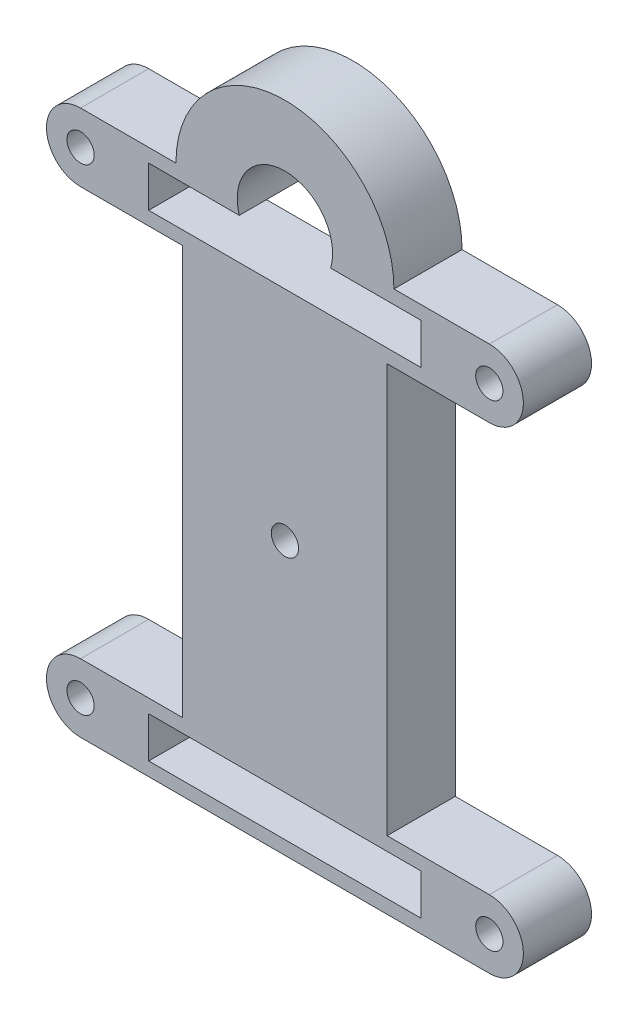
ISO-10303-21;
HEADER;
FILE_DESCRIPTION(('STEP AP214'),'2;1');
FILE_NAME('part.step','',(''),(''),'','','');
FILE_SCHEMA(('AUTOMOTIVE_DESIGN { 1 0 10303 214 1 1 1 1 }'));
ENDSEC;
DATA;
#1=APPLICATION_CONTEXT('core data for automotive mechanical design processes');
#2=APPLICATION_PROTOCOL_DEFINITION('international standard','automotive_design',2000,#1);
#3=PRODUCT_CONTEXT('',#1,'mechanical');
#4=PRODUCT('Part','Part','',(#3));
#5=PRODUCT_RELATED_PRODUCT_CATEGORY('part','',(#4));
#6=PRODUCT_DEFINITION_FORMATION('','',#4);
#7=PRODUCT_DEFINITION_CONTEXT('part definition',#1,'design');
#8=PRODUCT_DEFINITION('design','',#6,#7);
#9=PRODUCT_DEFINITION_SHAPE('','',#8);
#10=(LENGTH_UNIT() NAMED_UNIT(*) SI_UNIT(.MILLI.,.METRE.));
#11=(NAMED_UNIT(*) PLANE_ANGLE_UNIT() SI_UNIT($,.RADIAN.));
#12=(NAMED_UNIT(*) SI_UNIT($,.STERADIAN.) SOLID_ANGLE_UNIT());
#13=UNCERTAINTY_MEASURE_WITH_UNIT(LENGTH_MEASURE(1.E-05),#10,'distance_accuracy_value','');
#14=(GEOMETRIC_REPRESENTATION_CONTEXT(3) GLOBAL_UNCERTAINTY_ASSIGNED_CONTEXT((#13)) GLOBAL_UNIT_ASSIGNED_CONTEXT((#10,
#11,#12)) REPRESENTATION_CONTEXT('',''));
#15=CARTESIAN_POINT('',(0.,0.,0.));
#16=DIRECTION('',(0.,0.,1.));
#17=DIRECTION('',(1.,0.,0.));
#18=AXIS2_PLACEMENT_3D('',#15,#16,#17);
#19=CARTESIAN_POINT('',(15.,-17.5,2.5));
#20=DIRECTION('',(0.,0.,-1.));
#21=DIRECTION('',(-1.,0.,0.));
#22=AXIS2_PLACEMENT_3D('',#19,#20,#21);
#23=PLANE('',#22);
#24=DIRECTION('',(0.,1.,0.));
#25=VECTOR('',#24,1.);
#26=CARTESIAN_POINT('',(9.99999999999997,-19.,2.5));
#27=LINE('',#26,#25);
#28=CARTESIAN_POINT('',(9.99999999999997,-19.,2.5));
#29=VERTEX_POINT('',#28);
#30=CARTESIAN_POINT('',(9.99999999999998,-16.,2.5));
#31=VERTEX_POINT('',#30);
#32=EDGE_CURVE('E257',#29,#31,#27,.T.);
#33=ORIENTED_EDGE('',*,*,#32,.F.);
#34=DIRECTION('',(1.,0.,0.));
#35=VECTOR('',#34,1.);
#36=CARTESIAN_POINT('',(-10.,-19.,2.5));
#37=LINE('',#36,#35);
#38=CARTESIAN_POINT('',(-10.,-19.,2.5));
#39=VERTEX_POINT('',#38);
#40=EDGE_CURVE('E49',#39,#29,#37,.T.);
#41=ORIENTED_EDGE('',*,*,#40,.F.);
#42=DIRECTION('',(0.,-1.,0.));
#43=VECTOR('',#42,1.);
#44=CARTESIAN_POINT('',(-10.,-19.,2.5));
#45=LINE('',#44,#43);
#46=CARTESIAN_POINT('',(-10.,-16.,2.5));
#47=VERTEX_POINT('',#46);
#48=EDGE_CURVE('E248',#47,#39,#45,.T.);
#49=ORIENTED_EDGE('',*,*,#48,.F.);
#50=DIRECTION('',(-1.,0.,0.));
#51=VECTOR('',#50,1.);
#52=CARTESIAN_POINT('',(-10.,-16.,2.5));
#53=LINE('',#52,#51);
#54=EDGE_CURVE('E260',#31,#47,#53,.T.);
#55=ORIENTED_EDGE('',*,*,#54,.F.);
#56=EDGE_LOOP('',(#33,#41,#49,#55));
#57=FACE_BOUND('',#56,.T.);
#58=CARTESIAN_POINT('',(0.,0.,2.5));
#59=DIRECTION('',(0.,0.,1.));
#60=DIRECTION('',(1.,0.,0.));
#61=AXIS2_PLACEMENT_3D('',#58,#59,#60);
#62=CIRCLE('',#61,1.);
#63=CARTESIAN_POINT('',(1.,0.,2.5));
#64=VERTEX_POINT('',#63);
#65=EDGE_CURVE('E239',#64,#64,#62,.T.);
#66=ORIENTED_EDGE('',*,*,#65,.F.);
#67=EDGE_LOOP('',(#66));
#68=FACE_BOUND('',#67,.T.);
#69=DIRECTION('',(-1.,0.,0.));
#70=VECTOR('',#69,1.);
#71=CARTESIAN_POINT('',(7.5,-15.,2.5));
#72=LINE('',#71,#70);
#73=CARTESIAN_POINT('',(15.,-15.,2.5));
#74=VERTEX_POINT('',#73);
#75=CARTESIAN_POINT('',(7.5,-15.,2.5));
#76=VERTEX_POINT('',#75);
#77=EDGE_CURVE('E306',#74,#76,#72,.T.);
#78=ORIENTED_EDGE('',*,*,#77,.T.);
#79=DIRECTION('',(0.,1.,0.));
#80=VECTOR('',#79,1.);
#81=CARTESIAN_POINT('',(7.5,15.,2.5));
#82=LINE('',#81,#80);
#83=CARTESIAN_POINT('',(7.5,15.,2.5));
#84=VERTEX_POINT('',#83);
#85=EDGE_CURVE('E309',#76,#84,#82,.T.);
#86=ORIENTED_EDGE('',*,*,#85,.T.);
#87=DIRECTION('',(1.,0.,0.));
#88=VECTOR('',#87,1.);
#89=CARTESIAN_POINT('',(7.5,15.,2.5));
#90=LINE('',#89,#88);
#91=CARTESIAN_POINT('',(15.,15.,2.5));
#92=VERTEX_POINT('',#91);
#93=EDGE_CURVE('E312',#84,#92,#90,.T.);
#94=ORIENTED_EDGE('',*,*,#93,.T.);
#95=CARTESIAN_POINT('',(15.,17.5,2.5));
#96=DIRECTION('',(0.,0.,1.));
#97=DIRECTION('',(1.,0.,0.));
#98=AXIS2_PLACEMENT_3D('',#95,#96,#97);
#99=CIRCLE('',#98,2.5);
#100=CARTESIAN_POINT('',(15.,20.,2.5));
#101=VERTEX_POINT('',#100);
#102=EDGE_CURVE('E314',#92,#101,#99,.T.);
#103=ORIENTED_EDGE('',*,*,#102,.T.);
#104=DIRECTION('',(-1.,0.,0.));
#105=VECTOR('',#104,1.);
#106=CARTESIAN_POINT('',(15.,20.,2.5));
#107=LINE('',#106,#105);
#108=CARTESIAN_POINT('',(8.,20.,2.5));
#109=VERTEX_POINT('',#108);
#110=EDGE_CURVE('E316',#101,#109,#107,.T.);
#111=ORIENTED_EDGE('',*,*,#110,.T.);
#112=CARTESIAN_POINT('',(0.,20.,2.5));
#113=DIRECTION('',(0.,0.,1.));
#114=DIRECTION('',(1.,0.,0.));
#115=AXIS2_PLACEMENT_3D('',#112,#113,#114);
#116=CIRCLE('',#115,8.);
#117=CARTESIAN_POINT('',(-8.,20.,2.5));
#118=VERTEX_POINT('',#117);
#119=EDGE_CURVE('E318',#109,#118,#116,.T.);
#120=ORIENTED_EDGE('',*,*,#119,.T.);
#121=DIRECTION('',(-1.,0.,0.));
#122=VECTOR('',#121,1.);
#123=CARTESIAN_POINT('',(-15.,20.,2.5));
#124=LINE('',#123,#122);
#125=CARTESIAN_POINT('',(-15.,20.,2.5));
#126=VERTEX_POINT('',#125);
#127=EDGE_CURVE('E320',#118,#126,#124,.T.);
#128=ORIENTED_EDGE('',*,*,#127,.T.);
#129=CARTESIAN_POINT('',(-15.,17.5,2.5));
#130=DIRECTION('',(0.,0.,1.));
#131=DIRECTION('',(1.,0.,0.));
#132=AXIS2_PLACEMENT_3D('',#129,#130,#131);
#133=CIRCLE('',#132,2.5);
#134=CARTESIAN_POINT('',(-15.,15.,2.5));
#135=VERTEX_POINT('',#134);
#136=EDGE_CURVE('E322',#126,#135,#133,.T.);
#137=ORIENTED_EDGE('',*,*,#136,.T.);
#138=DIRECTION('',(1.,0.,0.));
#139=VECTOR('',#138,1.);
#140=CARTESIAN_POINT('',(-15.,15.,2.5));
#141=LINE('',#140,#139);
#142=CARTESIAN_POINT('',(-7.5,15.,2.5));
#143=VERTEX_POINT('',#142);
#144=EDGE_CURVE('E324',#135,#143,#141,.T.);
#145=ORIENTED_EDGE('',*,*,#144,.T.);
#146=DIRECTION('',(0.,-1.,0.));
#147=VECTOR('',#146,1.);
#148=CARTESIAN_POINT('',(-7.5,15.,2.5));
#149=LINE('',#148,#147);
#150=CARTESIAN_POINT('',(-7.5,-15.,2.5));
#151=VERTEX_POINT('',#150);
#152=EDGE_CURVE('E326',#143,#151,#149,.T.);
#153=ORIENTED_EDGE('',*,*,#152,.T.);
#154=DIRECTION('',(-1.,0.,0.));
#155=VECTOR('',#154,1.);
#156=CARTESIAN_POINT('',(-15.,-15.,2.5));
#157=LINE('',#156,#155);
#158=CARTESIAN_POINT('',(-15.,-15.,2.5));
#159=VERTEX_POINT('',#158);
#160=EDGE_CURVE('E328',#151,#159,#157,.T.);
#161=ORIENTED_EDGE('',*,*,#160,.T.);
#162=CARTESIAN_POINT('',(-15.,-17.5,2.5));
#163=DIRECTION('',(0.,0.,1.));
#164=DIRECTION('',(-1.,0.,0.));
#165=AXIS2_PLACEMENT_3D('',#162,#163,#164);
#166=CIRCLE('',#165,2.5);
#167=CARTESIAN_POINT('',(-15.,-20.,2.5));
#168=VERTEX_POINT('',#167);
#169=EDGE_CURVE('E330',#159,#168,#166,.T.);
#170=ORIENTED_EDGE('',*,*,#169,.T.);
#171=DIRECTION('',(1.,0.,0.));
#172=VECTOR('',#171,1.);
#173=CARTESIAN_POINT('',(-15.,-20.,2.5));
#174=LINE('',#173,#172);
#175=CARTESIAN_POINT('',(15.,-20.,2.5));
#176=VERTEX_POINT('',#175);
#177=EDGE_CURVE('E332',#168,#176,#174,.T.);
#178=ORIENTED_EDGE('',*,*,#177,.T.);
#179=CARTESIAN_POINT('',(15.,-17.5,2.5));
#180=DIRECTION('',(0.,0.,1.));
#181=DIRECTION('',(-1.,0.,0.));
#182=AXIS2_PLACEMENT_3D('',#179,#180,#181);
#183=CIRCLE('',#182,2.5);
#184=EDGE_CURVE('E334',#176,#74,#183,.T.);
#185=ORIENTED_EDGE('',*,*,#184,.T.);
#186=EDGE_LOOP('',(#78,#86,#94,#103,#111,#120,#128,#137,#145,#153,#161,#170,#178,#185));
#187=FACE_BOUND('',#186,.T.);
#188=CARTESIAN_POINT('',(15.,17.5,2.5));
#189=DIRECTION('',(0.,0.,1.));
#190=DIRECTION('',(1.,0.,0.));
#191=AXIS2_PLACEMENT_3D('',#188,#189,#190);
#192=CIRCLE('',#191,1.);
#193=CARTESIAN_POINT('',(16.,17.5,2.5));
#194=VERTEX_POINT('',#193);
#195=EDGE_CURVE('E300',#194,#194,#192,.T.);
#196=ORIENTED_EDGE('',*,*,#195,.F.);
#197=EDGE_LOOP('',(#196));
#198=FACE_BOUND('',#197,.T.);
#199=CARTESIAN_POINT('',(15.,-17.5,2.5));
#200=DIRECTION('',(0.,0.,1.));
#201=DIRECTION('',(-1.,0.,0.));
#202=AXIS2_PLACEMENT_3D('',#199,#200,#201);
#203=CIRCLE('',#202,1.);
#204=CARTESIAN_POINT('',(14.,-17.5,2.5));
#205=VERTEX_POINT('',#204);
#206=EDGE_CURVE('E294',#205,#205,#203,.T.);
#207=ORIENTED_EDGE('',*,*,#206,.F.);
#208=EDGE_LOOP('',(#207));
#209=FACE_BOUND('',#208,.T.);
#210=CARTESIAN_POINT('',(-15.,-17.5,2.5));
#211=DIRECTION('',(0.,0.,1.));
#212=DIRECTION('',(-1.,0.,0.));
#213=AXIS2_PLACEMENT_3D('',#210,#211,#212);
#214=CIRCLE('',#213,1.);
#215=CARTESIAN_POINT('',(-16.,-17.5,2.5));
#216=VERTEX_POINT('',#215);
#217=EDGE_CURVE('E288',#216,#216,#214,.T.);
#218=ORIENTED_EDGE('',*,*,#217,.F.);
#219=EDGE_LOOP('',(#218));
#220=FACE_BOUND('',#219,.T.);
#221=CARTESIAN_POINT('',(-15.,17.5,2.5));
#222=DIRECTION('',(0.,0.,1.));
#223=DIRECTION('',(1.,0.,0.));
#224=AXIS2_PLACEMENT_3D('',#221,#222,#223);
#225=CIRCLE('',#224,1.);
#226=CARTESIAN_POINT('',(-14.,17.5,2.5));
#227=VERTEX_POINT('',#226);
#228=EDGE_CURVE('E282',#227,#227,#225,.T.);
#229=ORIENTED_EDGE('',*,*,#228,.F.);
#230=EDGE_LOOP('',(#229));
#231=FACE_BOUND('',#230,.T.);
#232=DIRECTION('',(0.,-1.,0.));
#233=VECTOR('',#232,1.);
#234=CARTESIAN_POINT('',(-9.99999999999999,19.,2.5));
#235=LINE('',#234,#233);
#236=CARTESIAN_POINT('',(-9.99999999999999,19.,2.5));
#237=VERTEX_POINT('',#236);
#238=CARTESIAN_POINT('',(-9.99999999999999,16.,2.5));
#239=VERTEX_POINT('',#238);
#240=EDGE_CURVE('E225',#237,#239,#235,.T.);
#241=ORIENTED_EDGE('',*,*,#240,.F.);
#242=DIRECTION('',(-1.,0.,0.));
#243=VECTOR('',#242,1.);
#244=CARTESIAN_POINT('',(-9.99999999999999,19.,2.5));
#245=LINE('',#244,#243);
#246=CARTESIAN_POINT('',(-3.35410196624968,19.,2.5));
#247=VERTEX_POINT('',#246);
#248=EDGE_CURVE('E231',#247,#237,#245,.T.);
#249=ORIENTED_EDGE('',*,*,#248,.F.);
#250=CARTESIAN_POINT('',(0.,20.,2.5));
#251=DIRECTION('',(0.,0.,1.));
#252=DIRECTION('',(1.,0.,0.));
#253=AXIS2_PLACEMENT_3D('',#250,#251,#252);
#254=CIRCLE('',#253,3.5);
#255=CARTESIAN_POINT('',(3.35410196624968,19.,2.5));
#256=VERTEX_POINT('',#255);
#257=EDGE_CURVE('E277',#256,#247,#254,.T.);
#258=ORIENTED_EDGE('',*,*,#257,.F.);
#259=CARTESIAN_POINT('',(10.,19.,2.5));
#260=VERTEX_POINT('',#259);
#261=EDGE_CURVE('E233',#260,#256,#245,.T.);
#262=ORIENTED_EDGE('',*,*,#261,.F.);
#263=DIRECTION('',(0.,1.,0.));
#264=VECTOR('',#263,1.);
#265=CARTESIAN_POINT('',(10.,19.,2.5));
#266=LINE('',#265,#264);
#267=CARTESIAN_POINT('',(10.,16.,2.5));
#268=VERTEX_POINT('',#267);
#269=EDGE_CURVE('E201',#268,#260,#266,.T.);
#270=ORIENTED_EDGE('',*,*,#269,.F.);
#271=DIRECTION('',(1.,0.,0.));
#272=VECTOR('',#271,1.);
#273=CARTESIAN_POINT('',(-9.99999999999999,16.,2.5));
#274=LINE('',#273,#272);
#275=EDGE_CURVE('E222',#239,#268,#274,.T.);
#276=ORIENTED_EDGE('',*,*,#275,.F.);
#277=EDGE_LOOP('',(#241,#249,#258,#262,#270,#276));
#278=FACE_BOUND('',#277,.T.);
#279=ADVANCED_FACE('F34',(#57,#68,#187,#198,#209,#220,#231,#278),#23,.F.);
#280=CARTESIAN_POINT('',(15.,-17.5,-2.5));
#281=DIRECTION('',(0.,0.,-1.));
#282=DIRECTION('',(-1.,0.,0.));
#283=AXIS2_PLACEMENT_3D('',#280,#281,#282);
#284=PLANE('',#283);
#285=DIRECTION('',(-1.,0.,0.));
#286=VECTOR('',#285,1.);
#287=CARTESIAN_POINT('',(-9.99999999999999,19.,-2.5));
#288=LINE('',#287,#286);
#289=CARTESIAN_POINT('',(-3.35410196624968,19.,-2.5));
#290=VERTEX_POINT('',#289);
#291=CARTESIAN_POINT('',(-9.99999999999999,19.,-2.5));
#292=VERTEX_POINT('',#291);
#293=EDGE_CURVE('E215',#290,#292,#288,.T.);
#294=ORIENTED_EDGE('',*,*,#293,.T.);
#295=DIRECTION('',(0.,-1.,0.));
#296=VECTOR('',#295,1.);
#297=CARTESIAN_POINT('',(-9.99999999999999,19.,-2.5));
#298=LINE('',#297,#296);
#299=CARTESIAN_POINT('',(-9.99999999999999,16.,-2.5));
#300=VERTEX_POINT('',#299);
#301=EDGE_CURVE('E214',#292,#300,#298,.T.);
#302=ORIENTED_EDGE('',*,*,#301,.T.);
#303=DIRECTION('',(1.,0.,0.));
#304=VECTOR('',#303,1.);
#305=CARTESIAN_POINT('',(-9.99999999999999,16.,-2.5));
#306=LINE('',#305,#304);
#307=CARTESIAN_POINT('',(10.,16.,-2.5));
#308=VERTEX_POINT('',#307);
#309=EDGE_CURVE('E205',#300,#308,#306,.T.);
#310=ORIENTED_EDGE('',*,*,#309,.T.);
#311=DIRECTION('',(0.,1.,0.));
#312=VECTOR('',#311,1.);
#313=CARTESIAN_POINT('',(10.,19.,-2.5));
#314=LINE('',#313,#312);
#315=CARTESIAN_POINT('',(10.,19.,-2.5));
#316=VERTEX_POINT('',#315);
#317=EDGE_CURVE('E198',#308,#316,#314,.T.);
#318=ORIENTED_EDGE('',*,*,#317,.T.);
#319=CARTESIAN_POINT('',(3.35410196624968,19.,-2.5));
#320=VERTEX_POINT('',#319);
#321=EDGE_CURVE('E208',#316,#320,#288,.T.);
#322=ORIENTED_EDGE('',*,*,#321,.T.);
#323=CARTESIAN_POINT('',(0.,20.,-2.5));
#324=DIRECTION('',(0.,0.,1.));
#325=DIRECTION('',(1.,0.,0.));
#326=AXIS2_PLACEMENT_3D('',#323,#324,#325);
#327=CIRCLE('',#326,3.5);
#328=EDGE_CURVE('E274',#320,#290,#327,.T.);
#329=ORIENTED_EDGE('',*,*,#328,.T.);
#330=EDGE_LOOP('',(#294,#302,#310,#318,#322,#329));
#331=FACE_BOUND('',#330,.T.);
#332=DIRECTION('',(1.,0.,0.));
#333=VECTOR('',#332,1.);
#334=CARTESIAN_POINT('',(-10.,-19.,-2.5));
#335=LINE('',#334,#333);
#336=CARTESIAN_POINT('',(-10.,-19.,-2.5));
#337=VERTEX_POINT('',#336);
#338=CARTESIAN_POINT('',(9.99999999999997,-19.,-2.5));
#339=VERTEX_POINT('',#338);
#340=EDGE_CURVE('E244',#337,#339,#335,.T.);
#341=ORIENTED_EDGE('',*,*,#340,.T.);
#342=DIRECTION('',(0.,1.,0.));
#343=VECTOR('',#342,1.);
#344=CARTESIAN_POINT('',(9.99999999999997,-19.,-2.5));
#345=LINE('',#344,#343);
#346=CARTESIAN_POINT('',(9.99999999999998,-16.,-2.5));
#347=VERTEX_POINT('',#346);
#348=EDGE_CURVE('E247',#339,#347,#345,.T.);
#349=ORIENTED_EDGE('',*,*,#348,.T.);
#350=DIRECTION('',(-1.,0.,0.));
#351=VECTOR('',#350,1.);
#352=CARTESIAN_POINT('',(-10.,-16.,-2.5));
#353=LINE('',#352,#351);
#354=CARTESIAN_POINT('',(-10.,-16.,-2.5));
#355=VERTEX_POINT('',#354);
#356=EDGE_CURVE('E57',#347,#355,#353,.T.);
#357=ORIENTED_EDGE('',*,*,#356,.T.);
#358=DIRECTION('',(0.,-1.,0.));
#359=VECTOR('',#358,1.);
#360=CARTESIAN_POINT('',(-10.,-19.,-2.5));
#361=LINE('',#360,#359);
#362=EDGE_CURVE('E252',#355,#337,#361,.T.);
#363=ORIENTED_EDGE('',*,*,#362,.T.);
#364=EDGE_LOOP('',(#341,#349,#357,#363));
#365=FACE_BOUND('',#364,.T.);
#366=CARTESIAN_POINT('',(0.,0.,-2.5));
#367=DIRECTION('',(0.,0.,1.));
#368=DIRECTION('',(1.,0.,0.));
#369=AXIS2_PLACEMENT_3D('',#366,#367,#368);
#370=CIRCLE('',#369,1.);
#371=CARTESIAN_POINT('',(1.,0.,-2.5));
#372=VERTEX_POINT('',#371);
#373=EDGE_CURVE('E271',#372,#372,#370,.T.);
#374=ORIENTED_EDGE('',*,*,#373,.T.);
#375=EDGE_LOOP('',(#374));
#376=FACE_BOUND('',#375,.T.);
#377=CARTESIAN_POINT('',(-15.,17.5,-2.5));
#378=DIRECTION('',(0.,0.,1.));
#379=DIRECTION('',(1.,0.,0.));
#380=AXIS2_PLACEMENT_3D('',#377,#378,#379);
#381=CIRCLE('',#380,1.);
#382=CARTESIAN_POINT('',(-14.,17.5,-2.5));
#383=VERTEX_POINT('',#382);
#384=EDGE_CURVE('E280',#383,#383,#381,.T.);
#385=ORIENTED_EDGE('',*,*,#384,.T.);
#386=EDGE_LOOP('',(#385));
#387=FACE_BOUND('',#386,.T.);
#388=CARTESIAN_POINT('',(15.,-17.5,-2.5));
#389=DIRECTION('',(0.,0.,1.));
#390=DIRECTION('',(-1.,0.,0.));
#391=AXIS2_PLACEMENT_3D('',#388,#389,#390);
#392=CIRCLE('',#391,1.);
#393=CARTESIAN_POINT('',(14.,-17.5,-2.5));
#394=VERTEX_POINT('',#393);
#395=EDGE_CURVE('E291',#394,#394,#392,.T.);
#396=ORIENTED_EDGE('',*,*,#395,.T.);
#397=EDGE_LOOP('',(#396));
#398=FACE_BOUND('',#397,.T.);
#399=DIRECTION('',(-1.,0.,0.));
#400=VECTOR('',#399,1.);
#401=CARTESIAN_POINT('',(7.5,-15.,-2.5));
#402=LINE('',#401,#400);
#403=CARTESIAN_POINT('',(15.,-15.,-2.5));
#404=VERTEX_POINT('',#403);
#405=CARTESIAN_POINT('',(7.5,-15.,-2.5));
#406=VERTEX_POINT('',#405);
#407=EDGE_CURVE('E303',#404,#406,#402,.T.);
#408=ORIENTED_EDGE('',*,*,#407,.F.);
#409=CARTESIAN_POINT('',(15.,-17.5,-2.5));
#410=DIRECTION('',(0.,0.,1.));
#411=DIRECTION('',(-1.,0.,0.));
#412=AXIS2_PLACEMENT_3D('',#409,#410,#411);
#413=CIRCLE('',#412,2.5);
#414=CARTESIAN_POINT('',(15.,-20.,-2.5));
#415=VERTEX_POINT('',#414);
#416=EDGE_CURVE('E310',#415,#404,#413,.T.);
#417=ORIENTED_EDGE('',*,*,#416,.F.);
#418=DIRECTION('',(1.,0.,0.));
#419=VECTOR('',#418,1.);
#420=CARTESIAN_POINT('',(-15.,-20.,-2.5));
#421=LINE('',#420,#419);
#422=CARTESIAN_POINT('',(-15.,-20.,-2.5));
#423=VERTEX_POINT('',#422);
#424=EDGE_CURVE('E361',#423,#415,#421,.T.);
#425=ORIENTED_EDGE('',*,*,#424,.F.);
#426=CARTESIAN_POINT('',(-15.,-17.5,-2.5));
#427=DIRECTION('',(0.,0.,1.));
#428=DIRECTION('',(-1.,0.,0.));
#429=AXIS2_PLACEMENT_3D('',#426,#427,#428);
#430=CIRCLE('',#429,2.5);
#431=CARTESIAN_POINT('',(-15.,-15.,-2.5));
#432=VERTEX_POINT('',#431);
#433=EDGE_CURVE('E359',#432,#423,#430,.T.);
#434=ORIENTED_EDGE('',*,*,#433,.F.);
#435=DIRECTION('',(-1.,0.,0.));
#436=VECTOR('',#435,1.);
#437=CARTESIAN_POINT('',(-15.,-15.,-2.5));
#438=LINE('',#437,#436);
#439=CARTESIAN_POINT('',(-7.5,-15.,-2.5));
#440=VERTEX_POINT('',#439);
#441=EDGE_CURVE('E357',#440,#432,#438,.T.);
#442=ORIENTED_EDGE('',*,*,#441,.F.);
#443=DIRECTION('',(0.,-1.,0.));
#444=VECTOR('',#443,1.);
#445=CARTESIAN_POINT('',(-7.5,15.,-2.5));
#446=LINE('',#445,#444);
#447=CARTESIAN_POINT('',(-7.5,15.,-2.5));
#448=VERTEX_POINT('',#447);
#449=EDGE_CURVE('E355',#448,#440,#446,.T.);
#450=ORIENTED_EDGE('',*,*,#449,.F.);
#451=DIRECTION('',(1.,0.,0.));
#452=VECTOR('',#451,1.);
#453=CARTESIAN_POINT('',(-15.,15.,-2.5));
#454=LINE('',#453,#452);
#455=CARTESIAN_POINT('',(-15.,15.,-2.5));
#456=VERTEX_POINT('',#455);
#457=EDGE_CURVE('E353',#456,#448,#454,.T.);
#458=ORIENTED_EDGE('',*,*,#457,.F.);
#459=CARTESIAN_POINT('',(-15.,17.5,-2.5));
#460=DIRECTION('',(0.,0.,1.));
#461=DIRECTION('',(1.,0.,0.));
#462=AXIS2_PLACEMENT_3D('',#459,#460,#461);
#463=CIRCLE('',#462,2.5);
#464=CARTESIAN_POINT('',(-15.,20.,-2.5));
#465=VERTEX_POINT('',#464);
#466=EDGE_CURVE('E351',#465,#456,#463,.T.);
#467=ORIENTED_EDGE('',*,*,#466,.F.);
#468=DIRECTION('',(-1.,0.,0.));
#469=VECTOR('',#468,1.);
#470=CARTESIAN_POINT('',(-15.,20.,-2.5));
#471=LINE('',#470,#469);
#472=CARTESIAN_POINT('',(-8.,20.,-2.5));
#473=VERTEX_POINT('',#472);
#474=EDGE_CURVE('E349',#473,#465,#471,.T.);
#475=ORIENTED_EDGE('',*,*,#474,.F.);
#476=CARTESIAN_POINT('',(0.,20.,-2.5));
#477=DIRECTION('',(0.,0.,1.));
#478=DIRECTION('',(1.,0.,0.));
#479=AXIS2_PLACEMENT_3D('',#476,#477,#478);
#480=CIRCLE('',#479,8.);
#481=CARTESIAN_POINT('',(8.,20.,-2.5));
#482=VERTEX_POINT('',#481);
#483=EDGE_CURVE('E347',#482,#473,#480,.T.);
#484=ORIENTED_EDGE('',*,*,#483,.F.);
#485=DIRECTION('',(-1.,0.,0.));
#486=VECTOR('',#485,1.);
#487=CARTESIAN_POINT('',(15.,20.,-2.5));
#488=LINE('',#487,#486);
#489=CARTESIAN_POINT('',(15.,20.,-2.5));
#490=VERTEX_POINT('',#489);
#491=EDGE_CURVE('E345',#490,#482,#488,.T.);
#492=ORIENTED_EDGE('',*,*,#491,.F.);
#493=CARTESIAN_POINT('',(15.,17.5,-2.5));
#494=DIRECTION('',(0.,0.,1.));
#495=DIRECTION('',(1.,0.,0.));
#496=AXIS2_PLACEMENT_3D('',#493,#494,#495);
#497=CIRCLE('',#496,2.5);
#498=CARTESIAN_POINT('',(15.,15.,-2.5));
#499=VERTEX_POINT('',#498);
#500=EDGE_CURVE('E343',#499,#490,#497,.T.);
#501=ORIENTED_EDGE('',*,*,#500,.F.);
#502=DIRECTION('',(1.,0.,0.));
#503=VECTOR('',#502,1.);
#504=CARTESIAN_POINT('',(7.5,15.,-2.5));
#505=LINE('',#504,#503);
#506=CARTESIAN_POINT('',(7.5,15.,-2.5));
#507=VERTEX_POINT('',#506);
#508=EDGE_CURVE('E341',#507,#499,#505,.T.);
#509=ORIENTED_EDGE('',*,*,#508,.F.);
#510=DIRECTION('',(0.,1.,0.));
#511=VECTOR('',#510,1.);
#512=CARTESIAN_POINT('',(7.5,15.,-2.5));
#513=LINE('',#512,#511);
#514=EDGE_CURVE('E339',#406,#507,#513,.T.);
#515=ORIENTED_EDGE('',*,*,#514,.F.);
#516=EDGE_LOOP('',(#408,#417,#425,#434,#442,#450,#458,#467,#475,#484,#492,#501,#509,#515));
#517=FACE_BOUND('',#516,.T.);
#518=CARTESIAN_POINT('',(15.,17.5,-2.5));
#519=DIRECTION('',(0.,0.,1.));
#520=DIRECTION('',(1.,0.,0.));
#521=AXIS2_PLACEMENT_3D('',#518,#519,#520);
#522=CIRCLE('',#521,1.);
#523=CARTESIAN_POINT('',(16.,17.5,-2.5));
#524=VERTEX_POINT('',#523);
#525=EDGE_CURVE('E297',#524,#524,#522,.T.);
#526=ORIENTED_EDGE('',*,*,#525,.T.);
#527=EDGE_LOOP('',(#526));
#528=FACE_BOUND('',#527,.T.);
#529=CARTESIAN_POINT('',(-15.,-17.5,-2.5));
#530=DIRECTION('',(0.,0.,1.));
#531=DIRECTION('',(-1.,0.,0.));
#532=AXIS2_PLACEMENT_3D('',#529,#530,#531);
#533=CIRCLE('',#532,1.);
#534=CARTESIAN_POINT('',(-16.,-17.5,-2.5));
#535=VERTEX_POINT('',#534);
#536=EDGE_CURVE('E285',#535,#535,#533,.T.);
#537=ORIENTED_EDGE('',*,*,#536,.T.);
#538=EDGE_LOOP('',(#537));
#539=FACE_BOUND('',#538,.T.);
#540=ADVANCED_FACE('F218',(#331,#365,#376,#387,#398,#517,#528,#539),#284,.T.);
#541=CARTESIAN_POINT('',(7.5,-15.,2.5));
#542=DIRECTION('',(0.,-1.,0.));
#543=DIRECTION('',(1.,0.,0.));
#544=AXIS2_PLACEMENT_3D('',#541,#542,#543);
#545=PLANE('',#544);
#546=ORIENTED_EDGE('',*,*,#407,.T.);
#547=DIRECTION('',(0.,0.,-1.));
#548=VECTOR('',#547,1.);
#549=CARTESIAN_POINT('',(7.5,-15.,2.5));
#550=LINE('',#549,#548);
#551=EDGE_CURVE('E402',#76,#406,#550,.T.);
#552=ORIENTED_EDGE('',*,*,#551,.F.);
#553=ORIENTED_EDGE('',*,*,#77,.F.);
#554=DIRECTION('',(0.,0.,-1.));
#555=VECTOR('',#554,1.);
#556=CARTESIAN_POINT('',(15.,-15.,2.5));
#557=LINE('',#556,#555);
#558=EDGE_CURVE('E336',#74,#404,#557,.T.);
#559=ORIENTED_EDGE('',*,*,#558,.T.);
#560=EDGE_LOOP('',(#546,#552,#553,#559));
#561=FACE_BOUND('',#560,.T.);
#562=ADVANCED_FACE('F36',(#561),#545,.F.);
#563=CARTESIAN_POINT('',(7.5,15.,2.5));
#564=DIRECTION('',(-1.,0.,0.));
#565=DIRECTION('',(0.,-1.,0.));
#566=AXIS2_PLACEMENT_3D('',#563,#564,#565);
#567=PLANE('',#566);
#568=ORIENTED_EDGE('',*,*,#514,.T.);
#569=DIRECTION('',(0.,0.,-1.));
#570=VECTOR('',#569,1.);
#571=CARTESIAN_POINT('',(7.5,15.,2.5));
#572=LINE('',#571,#570);
#573=EDGE_CURVE('E399',#84,#507,#572,.T.);
#574=ORIENTED_EDGE('',*,*,#573,.F.);
#575=ORIENTED_EDGE('',*,*,#85,.F.);
#576=ORIENTED_EDGE('',*,*,#551,.T.);
#577=EDGE_LOOP('',(#568,#574,#575,#576));
#578=FACE_BOUND('',#577,.T.);
#579=ADVANCED_FACE('F486',(#578),#567,.F.);
#580=CARTESIAN_POINT('',(7.5,15.,2.5));
#581=DIRECTION('',(0.,1.,0.));
#582=DIRECTION('',(-1.,0.,0.));
#583=AXIS2_PLACEMENT_3D('',#580,#581,#582);
#584=PLANE('',#583);
#585=ORIENTED_EDGE('',*,*,#508,.T.);
#586=DIRECTION('',(0.,0.,-1.));
#587=VECTOR('',#586,1.);
#588=CARTESIAN_POINT('',(15.,15.,2.5));
#589=LINE('',#588,#587);
#590=EDGE_CURVE('E396',#92,#499,#589,.T.);
#591=ORIENTED_EDGE('',*,*,#590,.F.);
#592=ORIENTED_EDGE('',*,*,#93,.F.);
#593=ORIENTED_EDGE('',*,*,#573,.T.);
#594=EDGE_LOOP('',(#585,#591,#592,#593));
#595=FACE_BOUND('',#594,.T.);
#596=ADVANCED_FACE('F483',(#595),#584,.F.);
#597=CARTESIAN_POINT('',(15.,17.5,2.5));
#598=DIRECTION('',(0.,0.,-1.));
#599=DIRECTION('',(-1.,0.,0.));
#600=AXIS2_PLACEMENT_3D('',#597,#598,#599);
#601=CYLINDRICAL_SURFACE('',#600,2.5);
#602=ORIENTED_EDGE('',*,*,#500,.T.);
#603=DIRECTION('',(0.,0.,-1.));
#604=VECTOR('',#603,1.);
#605=CARTESIAN_POINT('',(15.,20.,2.5));
#606=LINE('',#605,#604);
#607=EDGE_CURVE('E393',#101,#490,#606,.T.);
#608=ORIENTED_EDGE('',*,*,#607,.F.);
#609=ORIENTED_EDGE('',*,*,#102,.F.);
#610=ORIENTED_EDGE('',*,*,#590,.T.);
#611=EDGE_LOOP('',(#602,#608,#609,#610));
#612=FACE_BOUND('',#611,.T.);
#613=ADVANCED_FACE('F479',(#612),#601,.T.);
#614=CARTESIAN_POINT('',(15.,20.,2.5));
#615=DIRECTION('',(0.,-1.,0.));
#616=DIRECTION('',(1.,0.,0.));
#617=AXIS2_PLACEMENT_3D('',#614,#615,#616);
#618=PLANE('',#617);
#619=ORIENTED_EDGE('',*,*,#491,.T.);
#620=DIRECTION('',(0.,0.,-1.));
#621=VECTOR('',#620,1.);
#622=CARTESIAN_POINT('',(8.,20.,2.5));
#623=LINE('',#622,#621);
#624=EDGE_CURVE('E390',#109,#482,#623,.T.);
#625=ORIENTED_EDGE('',*,*,#624,.F.);
#626=ORIENTED_EDGE('',*,*,#110,.F.);
#627=ORIENTED_EDGE('',*,*,#607,.T.);
#628=EDGE_LOOP('',(#619,#625,#626,#627));
#629=FACE_BOUND('',#628,.T.);
#630=ADVANCED_FACE('F475',(#629),#618,.F.);
#631=CARTESIAN_POINT('',(0.,20.,2.5));
#632=DIRECTION('',(0.,0.,-1.));
#633=DIRECTION('',(-1.,0.,0.));
#634=AXIS2_PLACEMENT_3D('',#631,#632,#633);
#635=CYLINDRICAL_SURFACE('',#634,8.);
#636=ORIENTED_EDGE('',*,*,#483,.T.);
#637=DIRECTION('',(0.,0.,-1.));
#638=VECTOR('',#637,1.);
#639=CARTESIAN_POINT('',(-8.,20.,2.5));
#640=LINE('',#639,#638);
#641=EDGE_CURVE('E387',#118,#473,#640,.T.);
#642=ORIENTED_EDGE('',*,*,#641,.F.);
#643=ORIENTED_EDGE('',*,*,#119,.F.);
#644=ORIENTED_EDGE('',*,*,#624,.T.);
#645=EDGE_LOOP('',(#636,#642,#643,#644));
#646=FACE_BOUND('',#645,.T.);
#647=ADVANCED_FACE('F471',(#646),#635,.T.);
#648=CARTESIAN_POINT('',(-15.,20.,2.5));
#649=DIRECTION('',(0.,-1.,0.));
#650=DIRECTION('',(1.,0.,0.));
#651=AXIS2_PLACEMENT_3D('',#648,#649,#650);
#652=PLANE('',#651);
#653=ORIENTED_EDGE('',*,*,#474,.T.);
#654=DIRECTION('',(0.,0.,-1.));
#655=VECTOR('',#654,1.);
#656=CARTESIAN_POINT('',(-15.,20.,2.5));
#657=LINE('',#656,#655);
#658=EDGE_CURVE('E384',#126,#465,#657,.T.);
#659=ORIENTED_EDGE('',*,*,#658,.F.);
#660=ORIENTED_EDGE('',*,*,#127,.F.);
#661=ORIENTED_EDGE('',*,*,#641,.T.);
#662=EDGE_LOOP('',(#653,#659,#660,#661));
#663=FACE_BOUND('',#662,.T.);
#664=ADVANCED_FACE('F467',(#663),#652,.F.);
#665=CARTESIAN_POINT('',(-15.,17.5,2.5));
#666=DIRECTION('',(0.,0.,-1.));
#667=DIRECTION('',(-1.,0.,0.));
#668=AXIS2_PLACEMENT_3D('',#665,#666,#667);
#669=CYLINDRICAL_SURFACE('',#668,2.5);
#670=ORIENTED_EDGE('',*,*,#466,.T.);
#671=DIRECTION('',(0.,0.,-1.));
#672=VECTOR('',#671,1.);
#673=CARTESIAN_POINT('',(-15.,15.,2.5));
#674=LINE('',#673,#672);
#675=EDGE_CURVE('E381',#135,#456,#674,.T.);
#676=ORIENTED_EDGE('',*,*,#675,.F.);
#677=ORIENTED_EDGE('',*,*,#136,.F.);
#678=ORIENTED_EDGE('',*,*,#658,.T.);
#679=EDGE_LOOP('',(#670,#676,#677,#678));
#680=FACE_BOUND('',#679,.T.);
#681=ADVANCED_FACE('F463',(#680),#669,.T.);
#682=CARTESIAN_POINT('',(-15.,15.,2.5));
#683=DIRECTION('',(0.,1.,0.));
#684=DIRECTION('',(0.,0.,1.));
#685=AXIS2_PLACEMENT_3D('',#682,#683,#684);
#686=PLANE('',#685);
#687=ORIENTED_EDGE('',*,*,#457,.T.);
#688=DIRECTION('',(0.,0.,-1.));
#689=VECTOR('',#688,1.);
#690=CARTESIAN_POINT('',(-7.5,15.,2.5));
#691=LINE('',#690,#689);
#692=EDGE_CURVE('E378',#143,#448,#691,.T.);
#693=ORIENTED_EDGE('',*,*,#692,.F.);
#694=ORIENTED_EDGE('',*,*,#144,.F.);
#695=ORIENTED_EDGE('',*,*,#675,.T.);
#696=EDGE_LOOP('',(#687,#693,#694,#695));
#697=FACE_BOUND('',#696,.T.);
#698=ADVANCED_FACE('F459',(#697),#686,.F.);
#699=CARTESIAN_POINT('',(-7.5,15.,2.5));
#700=DIRECTION('',(1.,0.,0.));
#701=DIRECTION('',(0.,1.,0.));
#702=AXIS2_PLACEMENT_3D('',#699,#700,#701);
#703=PLANE('',#702);
#704=ORIENTED_EDGE('',*,*,#449,.T.);
#705=DIRECTION('',(0.,0.,-1.));
#706=VECTOR('',#705,1.);
#707=CARTESIAN_POINT('',(-7.5,-15.,2.5));
#708=LINE('',#707,#706);
#709=EDGE_CURVE('E375',#151,#440,#708,.T.);
#710=ORIENTED_EDGE('',*,*,#709,.F.);
#711=ORIENTED_EDGE('',*,*,#152,.F.);
#712=ORIENTED_EDGE('',*,*,#692,.T.);
#713=EDGE_LOOP('',(#704,#710,#711,#712));
#714=FACE_BOUND('',#713,.T.);
#715=ADVANCED_FACE('F455',(#714),#703,.F.);
#716=CARTESIAN_POINT('',(-15.,-15.,2.5));
#717=DIRECTION('',(0.,-1.,0.));
#718=DIRECTION('',(1.,0.,0.));
#719=AXIS2_PLACEMENT_3D('',#716,#717,#718);
#720=PLANE('',#719);
#721=ORIENTED_EDGE('',*,*,#441,.T.);
#722=DIRECTION('',(0.,0.,-1.));
#723=VECTOR('',#722,1.);
#724=CARTESIAN_POINT('',(-15.,-15.,2.5));
#725=LINE('',#724,#723);
#726=EDGE_CURVE('E372',#159,#432,#725,.T.);
#727=ORIENTED_EDGE('',*,*,#726,.F.);
#728=ORIENTED_EDGE('',*,*,#160,.F.);
#729=ORIENTED_EDGE('',*,*,#709,.T.);
#730=EDGE_LOOP('',(#721,#727,#728,#729));
#731=FACE_BOUND('',#730,.T.);
#732=ADVANCED_FACE('F451',(#731),#720,.F.);
#733=CARTESIAN_POINT('',(-15.,-17.5,2.5));
#734=DIRECTION('',(0.,0.,-1.));
#735=DIRECTION('',(-1.,0.,0.));
#736=AXIS2_PLACEMENT_3D('',#733,#734,#735);
#737=CYLINDRICAL_SURFACE('',#736,2.5);
#738=ORIENTED_EDGE('',*,*,#433,.T.);
#739=DIRECTION('',(0.,0.,-1.));
#740=VECTOR('',#739,1.);
#741=CARTESIAN_POINT('',(-15.,-20.,2.5));
#742=LINE('',#741,#740);
#743=EDGE_CURVE('E369',#168,#423,#742,.T.);
#744=ORIENTED_EDGE('',*,*,#743,.F.);
#745=ORIENTED_EDGE('',*,*,#169,.F.);
#746=ORIENTED_EDGE('',*,*,#726,.T.);
#747=EDGE_LOOP('',(#738,#744,#745,#746));
#748=FACE_BOUND('',#747,.T.);
#749=ADVANCED_FACE('F447',(#748),#737,.T.);
#750=CARTESIAN_POINT('',(-15.,-20.,2.5));
#751=DIRECTION('',(0.,1.,0.));
#752=DIRECTION('',(0.,0.,1.));
#753=AXIS2_PLACEMENT_3D('',#750,#751,#752);
#754=PLANE('',#753);
#755=ORIENTED_EDGE('',*,*,#424,.T.);
#756=DIRECTION('',(0.,0.,-1.));
#757=VECTOR('',#756,1.);
#758=CARTESIAN_POINT('',(15.,-20.,2.5));
#759=LINE('',#758,#757);
#760=EDGE_CURVE('E366',#176,#415,#759,.T.);
#761=ORIENTED_EDGE('',*,*,#760,.F.);
#762=ORIENTED_EDGE('',*,*,#177,.F.);
#763=ORIENTED_EDGE('',*,*,#743,.T.);
#764=EDGE_LOOP('',(#755,#761,#762,#763));
#765=FACE_BOUND('',#764,.T.);
#766=ADVANCED_FACE('F443',(#765),#754,.F.);
#767=CARTESIAN_POINT('',(15.,-17.5,2.5));
#768=DIRECTION('',(0.,0.,-1.));
#769=DIRECTION('',(-1.,0.,0.));
#770=AXIS2_PLACEMENT_3D('',#767,#768,#769);
#771=CYLINDRICAL_SURFACE('',#770,2.5);
#772=ORIENTED_EDGE('',*,*,#416,.T.);
#773=ORIENTED_EDGE('',*,*,#558,.F.);
#774=ORIENTED_EDGE('',*,*,#184,.F.);
#775=ORIENTED_EDGE('',*,*,#760,.T.);
#776=EDGE_LOOP('',(#772,#773,#774,#775));
#777=FACE_BOUND('',#776,.T.);
#778=ADVANCED_FACE('F440',(#777),#771,.T.);
#779=CARTESIAN_POINT('',(15.,17.5,2.5));
#780=DIRECTION('',(0.,0.,-1.));
#781=DIRECTION('',(-1.,0.,0.));
#782=AXIS2_PLACEMENT_3D('',#779,#780,#781);
#783=CYLINDRICAL_SURFACE('',#782,1.);
#784=ORIENTED_EDGE('',*,*,#195,.T.);
#785=EDGE_LOOP('',(#784));
#786=FACE_BOUND('',#785,.T.);
#787=ORIENTED_EDGE('',*,*,#525,.F.);
#788=EDGE_LOOP('',(#787));
#789=FACE_BOUND('',#788,.T.);
#790=ADVANCED_FACE('F437',(#786,#789),#783,.F.);
#791=CARTESIAN_POINT('',(15.,-17.5,2.5));
#792=DIRECTION('',(0.,0.,-1.));
#793=DIRECTION('',(-1.,0.,0.));
#794=AXIS2_PLACEMENT_3D('',#791,#792,#793);
#795=CYLINDRICAL_SURFACE('',#794,1.);
#796=ORIENTED_EDGE('',*,*,#206,.T.);
#797=EDGE_LOOP('',(#796));
#798=FACE_BOUND('',#797,.T.);
#799=ORIENTED_EDGE('',*,*,#395,.F.);
#800=EDGE_LOOP('',(#799));
#801=FACE_BOUND('',#800,.T.);
#802=ADVANCED_FACE('F556',(#798,#801),#795,.F.);
#803=CARTESIAN_POINT('',(-15.,-17.5,2.5));
#804=DIRECTION('',(0.,0.,-1.));
#805=DIRECTION('',(-1.,0.,0.));
#806=AXIS2_PLACEMENT_3D('',#803,#804,#805);
#807=CYLINDRICAL_SURFACE('',#806,1.);
#808=ORIENTED_EDGE('',*,*,#217,.T.);
#809=EDGE_LOOP('',(#808));
#810=FACE_BOUND('',#809,.T.);
#811=ORIENTED_EDGE('',*,*,#536,.F.);
#812=EDGE_LOOP('',(#811));
#813=FACE_BOUND('',#812,.T.);
#814=ADVANCED_FACE('F549',(#810,#813),#807,.F.);
#815=CARTESIAN_POINT('',(-15.,17.5,2.5));
#816=DIRECTION('',(0.,0.,-1.));
#817=DIRECTION('',(-1.,0.,0.));
#818=AXIS2_PLACEMENT_3D('',#815,#816,#817);
#819=CYLINDRICAL_SURFACE('',#818,1.);
#820=ORIENTED_EDGE('',*,*,#228,.T.);
#821=EDGE_LOOP('',(#820));
#822=FACE_BOUND('',#821,.T.);
#823=ORIENTED_EDGE('',*,*,#384,.F.);
#824=EDGE_LOOP('',(#823));
#825=FACE_BOUND('',#824,.T.);
#826=ADVANCED_FACE('F546',(#822,#825),#819,.F.);
#827=CARTESIAN_POINT('',(0.,20.,2.5));
#828=DIRECTION('',(0.,0.,-1.));
#829=DIRECTION('',(-1.,0.,0.));
#830=AXIS2_PLACEMENT_3D('',#827,#828,#829);
#831=CYLINDRICAL_SURFACE('',#830,3.5);
#832=DIRECTION('',(0.,0.,-1.));
#833=VECTOR('',#832,1.);
#834=CARTESIAN_POINT('',(3.35410196624968,19.,2.5));
#835=LINE('',#834,#833);
#836=EDGE_CURVE('E11',#256,#320,#835,.T.);
#837=ORIENTED_EDGE('',*,*,#836,.F.);
#838=ORIENTED_EDGE('',*,*,#257,.T.);
#839=DIRECTION('',(0.,0.,-1.));
#840=VECTOR('',#839,1.);
#841=CARTESIAN_POINT('',(-3.35410196624968,19.,2.5));
#842=LINE('',#841,#840);
#843=EDGE_CURVE('E42',#290,#247,#842,.F.);
#844=ORIENTED_EDGE('',*,*,#843,.F.);
#845=ORIENTED_EDGE('',*,*,#328,.F.);
#846=EDGE_LOOP('',(#837,#838,#844,#845));
#847=FACE_BOUND('',#846,.T.);
#848=ADVANCED_FACE('F413',(#847),#831,.F.);
#849=CARTESIAN_POINT('',(0.,0.,-2.5));
#850=DIRECTION('',(0.,0.,1.));
#851=DIRECTION('',(1.,0.,0.));
#852=AXIS2_PLACEMENT_3D('',#849,#850,#851);
#853=CYLINDRICAL_SURFACE('',#852,1.);
#854=ORIENTED_EDGE('',*,*,#373,.F.);
#855=EDGE_LOOP('',(#854));
#856=FACE_BOUND('',#855,.T.);
#857=ORIENTED_EDGE('',*,*,#65,.T.);
#858=EDGE_LOOP('',(#857));
#859=FACE_BOUND('',#858,.T.);
#860=ADVANCED_FACE('F569',(#856,#859),#853,.F.);
#861=CARTESIAN_POINT('',(-9.99999999999999,19.,-2.5));
#862=DIRECTION('',(0.,1.,0.));
#863=DIRECTION('',(-1.,0.,0.));
#864=AXIS2_PLACEMENT_3D('',#861,#862,#863);
#865=PLANE('',#864);
#866=ORIENTED_EDGE('',*,*,#836,.T.);
#867=ORIENTED_EDGE('',*,*,#321,.F.);
#868=DIRECTION('',(0.,0.,1.));
#869=VECTOR('',#868,1.);
#870=CARTESIAN_POINT('',(10.,19.,-2.5));
#871=LINE('',#870,#869);
#872=EDGE_CURVE('E194',#316,#260,#871,.T.);
#873=ORIENTED_EDGE('',*,*,#872,.T.);
#874=ORIENTED_EDGE('',*,*,#261,.T.);
#875=EDGE_LOOP('',(#866,#867,#873,#874));
#876=FACE_BOUND('',#875,.T.);
#877=ADVANCED_FACE('F209',(#876),#865,.F.);
#878=CARTESIAN_POINT('',(10.,19.,-2.5));
#879=DIRECTION('',(1.,0.,0.));
#880=DIRECTION('',(0.,0.,-1.));
#881=AXIS2_PLACEMENT_3D('',#878,#879,#880);
#882=PLANE('',#881);
#883=ORIENTED_EDGE('',*,*,#269,.T.);
#884=ORIENTED_EDGE('',*,*,#872,.F.);
#885=ORIENTED_EDGE('',*,*,#317,.F.);
#886=DIRECTION('',(0.,0.,1.));
#887=VECTOR('',#886,1.);
#888=CARTESIAN_POINT('',(10.,16.,-2.5));
#889=LINE('',#888,#887);
#890=EDGE_CURVE('E237',#308,#268,#889,.T.);
#891=ORIENTED_EDGE('',*,*,#890,.T.);
#892=EDGE_LOOP('',(#883,#884,#885,#891));
#893=FACE_BOUND('',#892,.T.);
#894=ADVANCED_FACE('F196',(#893),#882,.F.);
#895=CARTESIAN_POINT('',(-9.99999999999999,16.,-2.5));
#896=DIRECTION('',(0.,-1.,0.));
#897=DIRECTION('',(0.,0.,-1.));
#898=AXIS2_PLACEMENT_3D('',#895,#896,#897);
#899=PLANE('',#898);
#900=ORIENTED_EDGE('',*,*,#275,.T.);
#901=ORIENTED_EDGE('',*,*,#890,.F.);
#902=ORIENTED_EDGE('',*,*,#309,.F.);
#903=DIRECTION('',(0.,0.,1.));
#904=VECTOR('',#903,1.);
#905=CARTESIAN_POINT('',(-9.99999999999999,16.,-2.5));
#906=LINE('',#905,#904);
#907=EDGE_CURVE('E240',#300,#239,#906,.T.);
#908=ORIENTED_EDGE('',*,*,#907,.T.);
#909=EDGE_LOOP('',(#900,#901,#902,#908));
#910=FACE_BOUND('',#909,.T.);
#911=ADVANCED_FACE('F418',(#910),#899,.F.);
#912=CARTESIAN_POINT('',(-9.99999999999999,19.,-2.5));
#913=DIRECTION('',(-1.,0.,0.));
#914=DIRECTION('',(0.,0.,1.));
#915=AXIS2_PLACEMENT_3D('',#912,#913,#914);
#916=PLANE('',#915);
#917=ORIENTED_EDGE('',*,*,#240,.T.);
#918=ORIENTED_EDGE('',*,*,#907,.F.);
#919=ORIENTED_EDGE('',*,*,#301,.F.);
#920=DIRECTION('',(0.,0.,1.));
#921=VECTOR('',#920,1.);
#922=CARTESIAN_POINT('',(-9.99999999999999,19.,-2.5));
#923=LINE('',#922,#921);
#924=EDGE_CURVE('E204',#292,#237,#923,.T.);
#925=ORIENTED_EDGE('',*,*,#924,.T.);
#926=EDGE_LOOP('',(#917,#918,#919,#925));
#927=FACE_BOUND('',#926,.T.);
#928=ADVANCED_FACE('F416',(#927),#916,.F.);
#929=ORIENTED_EDGE('',*,*,#843,.T.);
#930=ORIENTED_EDGE('',*,*,#248,.T.);
#931=ORIENTED_EDGE('',*,*,#924,.F.);
#932=ORIENTED_EDGE('',*,*,#293,.F.);
#933=EDGE_LOOP('',(#929,#930,#931,#932));
#934=FACE_BOUND('',#933,.T.);
#935=ADVANCED_FACE('F407',(#934),#865,.F.);
#936=CARTESIAN_POINT('',(-10.,-19.,-2.5));
#937=DIRECTION('',(0.,-1.,0.));
#938=DIRECTION('',(1.,0.,0.));
#939=AXIS2_PLACEMENT_3D('',#936,#937,#938);
#940=PLANE('',#939);
#941=ORIENTED_EDGE('',*,*,#40,.T.);
#942=DIRECTION('',(0.,0.,1.));
#943=VECTOR('',#942,1.);
#944=CARTESIAN_POINT('',(9.99999999999997,-19.,-2.5));
#945=LINE('',#944,#943);
#946=EDGE_CURVE('E255',#339,#29,#945,.T.);
#947=ORIENTED_EDGE('',*,*,#946,.F.);
#948=ORIENTED_EDGE('',*,*,#340,.F.);
#949=DIRECTION('',(0.,0.,1.));
#950=VECTOR('',#949,1.);
#951=CARTESIAN_POINT('',(-10.,-19.,-2.5));
#952=LINE('',#951,#950);
#953=EDGE_CURVE('E232',#337,#39,#952,.T.);
#954=ORIENTED_EDGE('',*,*,#953,.T.);
#955=EDGE_LOOP('',(#941,#947,#948,#954));
#956=FACE_BOUND('',#955,.T.);
#957=ADVANCED_FACE('F573',(#956),#940,.F.);
#958=CARTESIAN_POINT('',(-10.,-19.,-2.5));
#959=DIRECTION('',(-1.,0.,0.));
#960=DIRECTION('',(0.,0.,1.));
#961=AXIS2_PLACEMENT_3D('',#958,#959,#960);
#962=PLANE('',#961);
#963=ORIENTED_EDGE('',*,*,#48,.T.);
#964=ORIENTED_EDGE('',*,*,#953,.F.);
#965=ORIENTED_EDGE('',*,*,#362,.F.);
#966=DIRECTION('',(0.,0.,1.));
#967=VECTOR('',#966,1.);
#968=CARTESIAN_POINT('',(-10.,-16.,-2.5));
#969=LINE('',#968,#967);
#970=EDGE_CURVE('E266',#355,#47,#969,.T.);
#971=ORIENTED_EDGE('',*,*,#970,.T.);
#972=EDGE_LOOP('',(#963,#964,#965,#971));
#973=FACE_BOUND('',#972,.T.);
#974=ADVANCED_FACE('F576',(#973),#962,.F.);
#975=CARTESIAN_POINT('',(-10.,-16.,-2.5));
#976=DIRECTION('',(0.,1.,0.));
#977=DIRECTION('',(-1.,0.,0.));
#978=AXIS2_PLACEMENT_3D('',#975,#976,#977);
#979=PLANE('',#978);
#980=ORIENTED_EDGE('',*,*,#54,.T.);
#981=ORIENTED_EDGE('',*,*,#970,.F.);
#982=ORIENTED_EDGE('',*,*,#356,.F.);
#983=DIRECTION('',(0.,0.,1.));
#984=VECTOR('',#983,1.);
#985=CARTESIAN_POINT('',(9.99999999999998,-16.,-2.5));
#986=LINE('',#985,#984);
#987=EDGE_CURVE('E268',#347,#31,#986,.T.);
#988=ORIENTED_EDGE('',*,*,#987,.T.);
#989=EDGE_LOOP('',(#980,#981,#982,#988));
#990=FACE_BOUND('',#989,.T.);
#991=ADVANCED_FACE('F580',(#990),#979,.F.);
#992=CARTESIAN_POINT('',(9.99999999999997,-19.,-2.5));
#993=DIRECTION('',(1.,0.,0.));
#994=DIRECTION('',(0.,1.,0.));
#995=AXIS2_PLACEMENT_3D('',#992,#993,#994);
#996=PLANE('',#995);
#997=ORIENTED_EDGE('',*,*,#32,.T.);
#998=ORIENTED_EDGE('',*,*,#987,.F.);
#999=ORIENTED_EDGE('',*,*,#348,.F.);
#1000=ORIENTED_EDGE('',*,*,#946,.T.);
#1001=EDGE_LOOP('',(#997,#998,#999,#1000));
#1002=FACE_BOUND('',#1001,.T.);
#1003=ADVANCED_FACE('F577',(#1002),#996,.F.);
#1004=CLOSED_SHELL('',(#279,#540,#562,#579,#596,#613,#630,#647,#664,#681,#698,#715,#732,#749,
#766,#778,#790,#802,#814,#826,#848,#860,#877,#894,#911,#928,#935,#957,#974,#991,#1003));
#1005=MANIFOLD_SOLID_BREP('B2',#1004);
#1006=ADVANCED_BREP_SHAPE_REPRESENTATION('',(#18,#1005),#14);
#1007=SHAPE_DEFINITION_REPRESENTATION(#9,#1006);
ENDSEC;
END-ISO-10303-21;
